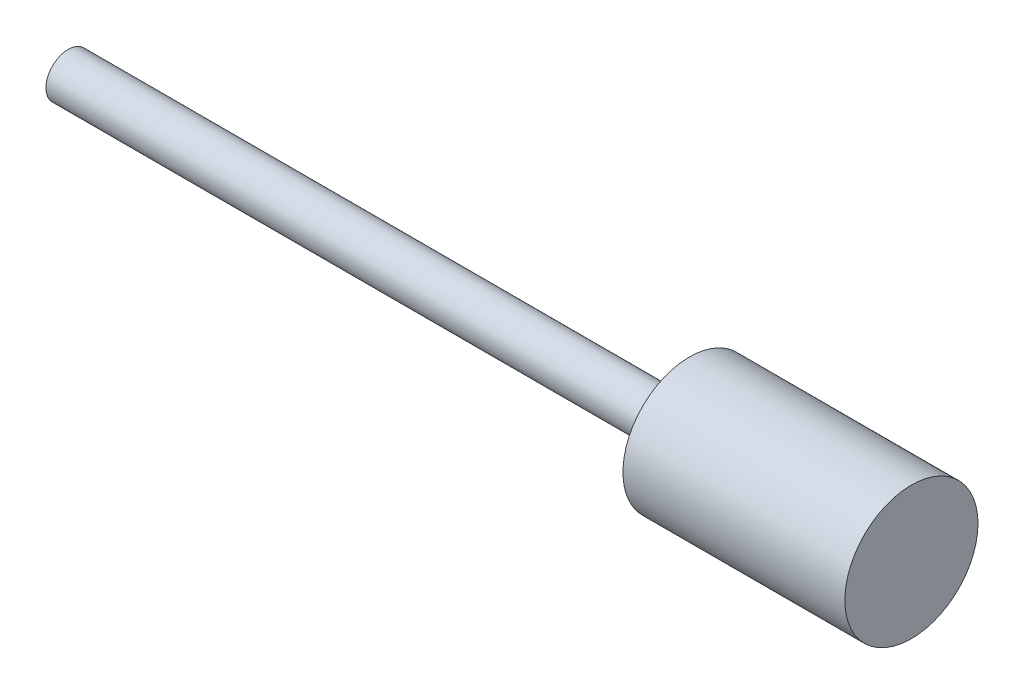
ISO-10303-21;
HEADER;
FILE_DESCRIPTION(('STEP AP214'),'2;1');
FILE_NAME('part.step','',(''),(''),'','','');
FILE_SCHEMA(('AUTOMOTIVE_DESIGN { 1 0 10303 214 1 1 1 1 }'));
ENDSEC;
DATA;
#1=APPLICATION_CONTEXT('core data for automotive mechanical design processes');
#2=APPLICATION_PROTOCOL_DEFINITION('international standard','automotive_design',2000,#1);
#3=PRODUCT_CONTEXT('',#1,'mechanical');
#4=PRODUCT('Part','Part','',(#3));
#5=PRODUCT_RELATED_PRODUCT_CATEGORY('part','',(#4));
#6=PRODUCT_DEFINITION_FORMATION('','',#4);
#7=PRODUCT_DEFINITION_CONTEXT('part definition',#1,'design');
#8=PRODUCT_DEFINITION('design','',#6,#7);
#9=PRODUCT_DEFINITION_SHAPE('','',#8);
#10=(LENGTH_UNIT() NAMED_UNIT(*) SI_UNIT(.MILLI.,.METRE.));
#11=(NAMED_UNIT(*) PLANE_ANGLE_UNIT() SI_UNIT($,.RADIAN.));
#12=(NAMED_UNIT(*) SI_UNIT($,.STERADIAN.) SOLID_ANGLE_UNIT());
#13=UNCERTAINTY_MEASURE_WITH_UNIT(LENGTH_MEASURE(1.E-05),#10,'distance_accuracy_value','');
#14=(GEOMETRIC_REPRESENTATION_CONTEXT(3) GLOBAL_UNCERTAINTY_ASSIGNED_CONTEXT((#13)) GLOBAL_UNIT_ASSIGNED_CONTEXT((#10,
#11,#12)) REPRESENTATION_CONTEXT('',''));
#15=CARTESIAN_POINT('',(0.,0.,0.));
#16=DIRECTION('',(0.,0.,1.));
#17=DIRECTION('',(1.,0.,0.));
#18=AXIS2_PLACEMENT_3D('',#15,#16,#17);
#19=CARTESIAN_POINT('',(140.,0.,0.));
#20=DIRECTION('',(-1.,0.,0.));
#21=DIRECTION('',(0.,0.,1.));
#22=AXIS2_PLACEMENT_3D('',#19,#20,#21);
#23=CYLINDRICAL_SURFACE('',#22,5.);
#24=CARTESIAN_POINT('',(140.,0.,0.));
#25=DIRECTION('',(1.,0.,0.));
#26=DIRECTION('',(0.,0.,-1.));
#27=AXIS2_PLACEMENT_3D('',#24,#25,#26);
#28=CIRCLE('',#27,5.);
#29=CARTESIAN_POINT('',(140.,0.,-5.));
#30=VERTEX_POINT('',#29);
#31=EDGE_CURVE('E10',#30,#30,#28,.T.);
#32=ORIENTED_EDGE('',*,*,#31,.F.);
#33=EDGE_LOOP('',(#32));
#34=FACE_BOUND('',#33,.T.);
#35=CARTESIAN_POINT('',(0.,0.,0.));
#36=DIRECTION('',(1.,0.,0.));
#37=DIRECTION('',(0.,0.,-1.));
#38=AXIS2_PLACEMENT_3D('',#35,#36,#37);
#39=CIRCLE('',#38,5.);
#40=CARTESIAN_POINT('',(0.,0.,-5.));
#41=VERTEX_POINT('',#40);
#42=EDGE_CURVE('E42',#41,#41,#39,.T.);
#43=ORIENTED_EDGE('',*,*,#42,.T.);
#44=EDGE_LOOP('',(#43));
#45=FACE_BOUND('',#44,.T.);
#46=ADVANCED_FACE('F39',(#34,#45),#23,.T.);
#47=CARTESIAN_POINT('',(0.,0.,0.));
#48=DIRECTION('',(1.,0.,0.));
#49=DIRECTION('',(0.,0.,-1.));
#50=AXIS2_PLACEMENT_3D('',#47,#48,#49);
#51=PLANE('',#50);
#52=ORIENTED_EDGE('',*,*,#42,.F.);
#53=EDGE_LOOP('',(#52));
#54=FACE_BOUND('',#53,.T.);
#55=ADVANCED_FACE('F62',(#54),#51,.F.);
#56=CARTESIAN_POINT('',(190.,0.,0.));
#57=DIRECTION('',(-1.,0.,0.));
#58=DIRECTION('',(0.,0.,1.));
#59=AXIS2_PLACEMENT_3D('',#56,#57,#58);
#60=CYLINDRICAL_SURFACE('',#59,15.);
#61=CARTESIAN_POINT('',(190.,0.,0.));
#62=DIRECTION('',(1.,0.,0.));
#63=DIRECTION('',(0.,0.,-1.));
#64=AXIS2_PLACEMENT_3D('',#61,#62,#63);
#65=CIRCLE('',#64,15.);
#66=CARTESIAN_POINT('',(190.,0.,-15.));
#67=VERTEX_POINT('',#66);
#68=EDGE_CURVE('E49',#67,#67,#65,.T.);
#69=ORIENTED_EDGE('',*,*,#68,.F.);
#70=EDGE_LOOP('',(#69));
#71=FACE_BOUND('',#70,.T.);
#72=CARTESIAN_POINT('',(140.,0.,0.));
#73=DIRECTION('',(1.,0.,0.));
#74=DIRECTION('',(0.,0.,-1.));
#75=AXIS2_PLACEMENT_3D('',#72,#73,#74);
#76=CIRCLE('',#75,15.);
#77=CARTESIAN_POINT('',(140.,0.,-15.));
#78=VERTEX_POINT('',#77);
#79=EDGE_CURVE('E51',#78,#78,#76,.T.);
#80=ORIENTED_EDGE('',*,*,#79,.T.);
#81=EDGE_LOOP('',(#80));
#82=FACE_BOUND('',#81,.T.);
#83=ADVANCED_FACE('F59',(#71,#82),#60,.T.);
#84=CARTESIAN_POINT('',(190.,0.,0.));
#85=DIRECTION('',(1.,0.,0.));
#86=DIRECTION('',(0.,0.,-1.));
#87=AXIS2_PLACEMENT_3D('',#84,#85,#86);
#88=PLANE('',#87);
#89=ORIENTED_EDGE('',*,*,#68,.T.);
#90=EDGE_LOOP('',(#89));
#91=FACE_BOUND('',#90,.T.);
#92=ADVANCED_FACE('F57',(#91),#88,.T.);
#93=CARTESIAN_POINT('',(140.,0.,0.));
#94=DIRECTION('',(1.,0.,0.));
#95=DIRECTION('',(0.,0.,-1.));
#96=AXIS2_PLACEMENT_3D('',#93,#94,#95);
#97=PLANE('',#96);
#98=ORIENTED_EDGE('',*,*,#31,.T.);
#99=EDGE_LOOP('',(#98));
#100=FACE_BOUND('',#99,.T.);
#101=ORIENTED_EDGE('',*,*,#79,.F.);
#102=EDGE_LOOP('',(#101));
#103=FACE_BOUND('',#102,.T.);
#104=ADVANCED_FACE('F66',(#100,#103),#97,.F.);
#105=CLOSED_SHELL('',(#46,#55,#83,#92,#104));
#106=MANIFOLD_SOLID_BREP('B2',#105);
#107=ADVANCED_BREP_SHAPE_REPRESENTATION('',(#18,#106),#14);
#108=SHAPE_DEFINITION_REPRESENTATION(#9,#107);
ENDSEC;
END-ISO-10303-21;
